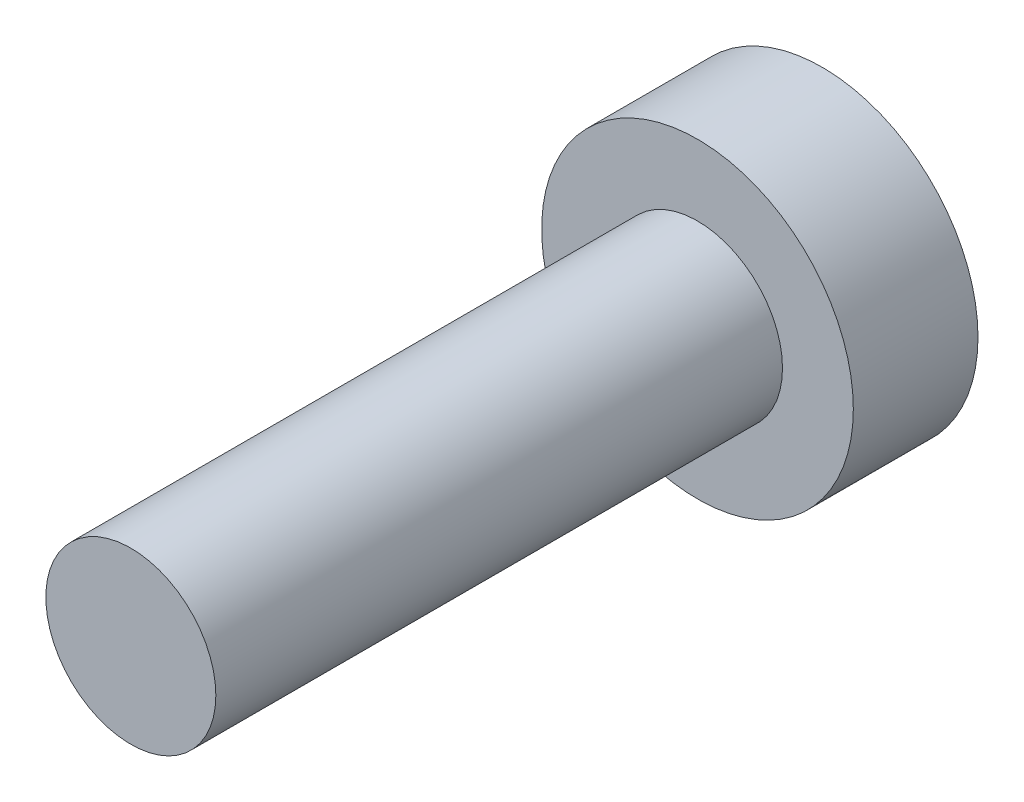
ISO-10303-21;
HEADER;
FILE_DESCRIPTION(('STEP AP214'),'2;1');
FILE_NAME('part.step','',(''),(''),'','','');
FILE_SCHEMA(('AUTOMOTIVE_DESIGN { 1 0 10303 214 1 1 1 1 }'));
ENDSEC;
DATA;
#1=APPLICATION_CONTEXT('core data for automotive mechanical design processes');
#2=APPLICATION_PROTOCOL_DEFINITION('international standard','automotive_design',2000,#1);
#3=PRODUCT_CONTEXT('',#1,'mechanical');
#4=PRODUCT('Part','Part','',(#3));
#5=PRODUCT_RELATED_PRODUCT_CATEGORY('part','',(#4));
#6=PRODUCT_DEFINITION_FORMATION('','',#4);
#7=PRODUCT_DEFINITION_CONTEXT('part definition',#1,'design');
#8=PRODUCT_DEFINITION('design','',#6,#7);
#9=PRODUCT_DEFINITION_SHAPE('','',#8);
#10=(LENGTH_UNIT() NAMED_UNIT(*) SI_UNIT(.MILLI.,.METRE.));
#11=(NAMED_UNIT(*) PLANE_ANGLE_UNIT() SI_UNIT($,.RADIAN.));
#12=(NAMED_UNIT(*) SI_UNIT($,.STERADIAN.) SOLID_ANGLE_UNIT());
#13=UNCERTAINTY_MEASURE_WITH_UNIT(LENGTH_MEASURE(1.E-05),#10,'distance_accuracy_value','');
#14=(GEOMETRIC_REPRESENTATION_CONTEXT(3) GLOBAL_UNCERTAINTY_ASSIGNED_CONTEXT((#13)) GLOBAL_UNIT_ASSIGNED_CONTEXT((#10,
#11,#12)) REPRESENTATION_CONTEXT('',''));
#15=CARTESIAN_POINT('',(0.,0.,0.));
#16=DIRECTION('',(0.,0.,1.));
#17=DIRECTION('',(1.,0.,0.));
#18=AXIS2_PLACEMENT_3D('',#15,#16,#17);
#19=CARTESIAN_POINT('',(0.,0.,2.2));
#20=DIRECTION('',(0.,0.,-1.));
#21=DIRECTION('',(-1.,0.,0.));
#22=AXIS2_PLACEMENT_3D('',#19,#20,#21);
#23=CYLINDRICAL_SURFACE('',#22,2.75);
#24=CARTESIAN_POINT('',(0.,0.,2.2));
#25=DIRECTION('',(0.,0.,1.));
#26=DIRECTION('',(1.,0.,0.));
#27=AXIS2_PLACEMENT_3D('',#24,#25,#26);
#28=CIRCLE('',#27,2.75);
#29=CARTESIAN_POINT('',(2.75,0.,2.2));
#30=VERTEX_POINT('',#29);
#31=EDGE_CURVE('E39',#30,#30,#28,.T.);
#32=ORIENTED_EDGE('',*,*,#31,.F.);
#33=EDGE_LOOP('',(#32));
#34=FACE_BOUND('',#33,.T.);
#35=CARTESIAN_POINT('',(0.,0.,0.));
#36=DIRECTION('',(0.,0.,1.));
#37=DIRECTION('',(1.,0.,0.));
#38=AXIS2_PLACEMENT_3D('',#35,#36,#37);
#39=CIRCLE('',#38,2.75);
#40=CARTESIAN_POINT('',(2.75,0.,0.));
#41=VERTEX_POINT('',#40);
#42=EDGE_CURVE('E35',#41,#41,#39,.T.);
#43=ORIENTED_EDGE('',*,*,#42,.T.);
#44=EDGE_LOOP('',(#43));
#45=FACE_BOUND('',#44,.T.);
#46=ADVANCED_FACE('F32',(#34,#45),#23,.T.);
#47=CARTESIAN_POINT('',(0.,0.,2.2));
#48=DIRECTION('',(0.,0.,1.));
#49=DIRECTION('',(1.,0.,0.));
#50=AXIS2_PLACEMENT_3D('',#47,#48,#49);
#51=PLANE('',#50);
#52=CARTESIAN_POINT('',(0.,0.,2.2));
#53=DIRECTION('',(0.,0.,1.));
#54=DIRECTION('',(1.,0.,0.));
#55=AXIS2_PLACEMENT_3D('',#52,#53,#54);
#56=CIRCLE('',#55,1.5);
#57=CARTESIAN_POINT('',(1.5,0.,2.2));
#58=VERTEX_POINT('',#57);
#59=EDGE_CURVE('E10',#58,#58,#56,.T.);
#60=ORIENTED_EDGE('',*,*,#59,.F.);
#61=EDGE_LOOP('',(#60));
#62=FACE_BOUND('',#61,.T.);
#63=ORIENTED_EDGE('',*,*,#31,.T.);
#64=EDGE_LOOP('',(#63));
#65=FACE_BOUND('',#64,.T.);
#66=ADVANCED_FACE('F56',(#62,#65),#51,.T.);
#67=CARTESIAN_POINT('',(0.,0.,0.));
#68=DIRECTION('',(0.,0.,1.));
#69=DIRECTION('',(1.,0.,0.));
#70=AXIS2_PLACEMENT_3D('',#67,#68,#69);
#71=PLANE('',#70);
#72=ORIENTED_EDGE('',*,*,#42,.F.);
#73=EDGE_LOOP('',(#72));
#74=FACE_BOUND('',#73,.T.);
#75=ADVANCED_FACE('F53',(#74),#71,.F.);
#76=CARTESIAN_POINT('',(0.,0.,12.2));
#77=DIRECTION('',(0.,0.,-1.));
#78=DIRECTION('',(-1.,0.,0.));
#79=AXIS2_PLACEMENT_3D('',#76,#77,#78);
#80=CYLINDRICAL_SURFACE('',#79,1.5);
#81=CARTESIAN_POINT('',(0.,0.,12.2));
#82=DIRECTION('',(0.,0.,1.));
#83=DIRECTION('',(1.,0.,0.));
#84=AXIS2_PLACEMENT_3D('',#81,#82,#83);
#85=CIRCLE('',#84,1.5);
#86=CARTESIAN_POINT('',(1.5,0.,12.2));
#87=VERTEX_POINT('',#86);
#88=EDGE_CURVE('E45',#87,#87,#85,.T.);
#89=ORIENTED_EDGE('',*,*,#88,.F.);
#90=EDGE_LOOP('',(#89));
#91=FACE_BOUND('',#90,.T.);
#92=ORIENTED_EDGE('',*,*,#59,.T.);
#93=EDGE_LOOP('',(#92));
#94=FACE_BOUND('',#93,.T.);
#95=ADVANCED_FACE('F55',(#91,#94),#80,.T.);
#96=CARTESIAN_POINT('',(0.,0.,12.2));
#97=DIRECTION('',(0.,0.,1.));
#98=DIRECTION('',(1.,0.,0.));
#99=AXIS2_PLACEMENT_3D('',#96,#97,#98);
#100=PLANE('',#99);
#101=ORIENTED_EDGE('',*,*,#88,.T.);
#102=EDGE_LOOP('',(#101));
#103=FACE_BOUND('',#102,.T.);
#104=ADVANCED_FACE('F61',(#103),#100,.T.);
#105=CLOSED_SHELL('',(#46,#66,#75,#95,#104));
#106=MANIFOLD_SOLID_BREP('B2',#105);
#107=ADVANCED_BREP_SHAPE_REPRESENTATION('',(#18,#106),#14);
#108=SHAPE_DEFINITION_REPRESENTATION(#9,#107);
ENDSEC;
END-ISO-10303-21;
